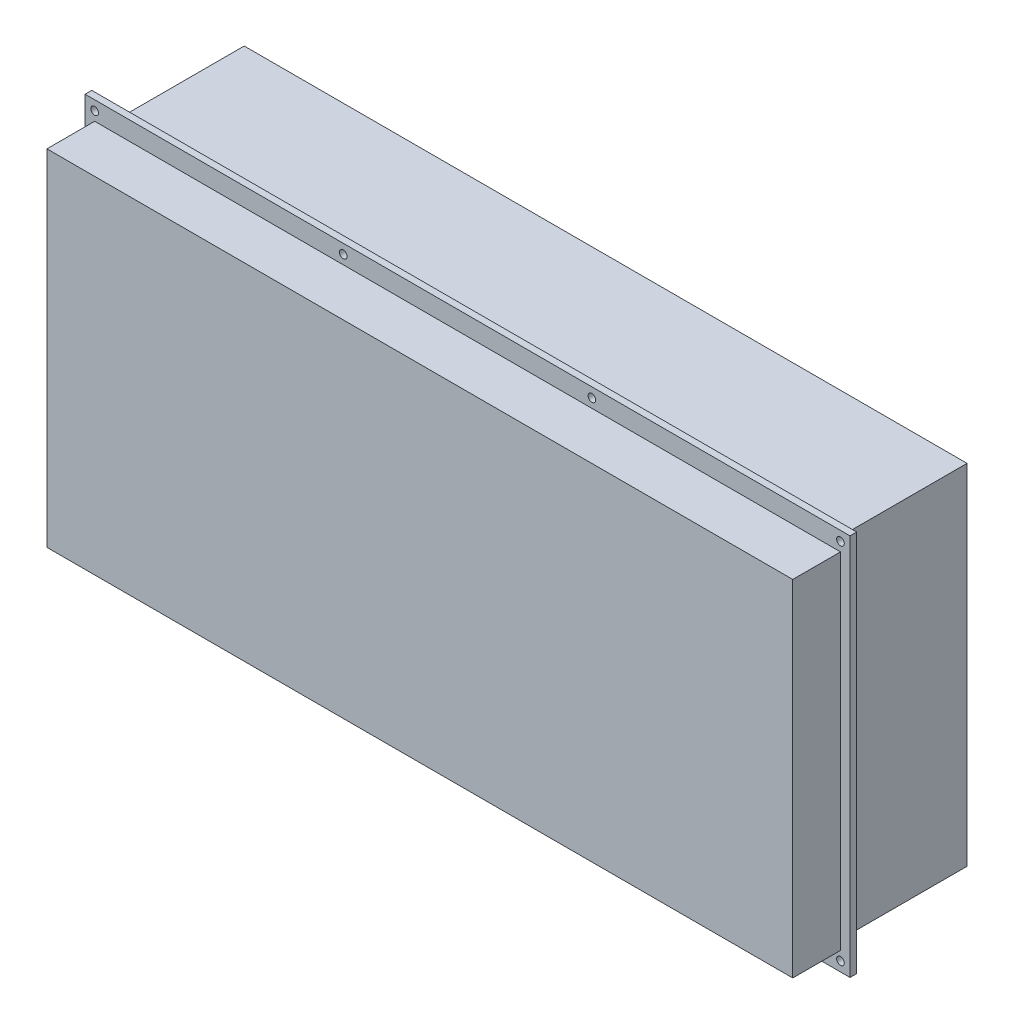
ISO-10303-21;
HEADER;
FILE_DESCRIPTION(('STEP AP214'),'2;1');
FILE_NAME('part.step','',(''),(''),'','','');
FILE_SCHEMA(('AUTOMOTIVE_DESIGN { 1 0 10303 214 1 1 1 1 }'));
ENDSEC;
DATA;
#1=APPLICATION_CONTEXT('core data for automotive mechanical design processes');
#2=APPLICATION_PROTOCOL_DEFINITION('international standard','automotive_design',2000,#1);
#3=PRODUCT_CONTEXT('',#1,'mechanical');
#4=PRODUCT('Part','Part','',(#3));
#5=PRODUCT_RELATED_PRODUCT_CATEGORY('part','',(#4));
#6=PRODUCT_DEFINITION_FORMATION('','',#4);
#7=PRODUCT_DEFINITION_CONTEXT('part definition',#1,'design');
#8=PRODUCT_DEFINITION('design','',#6,#7);
#9=PRODUCT_DEFINITION_SHAPE('','',#8);
#10=(LENGTH_UNIT() NAMED_UNIT(*) SI_UNIT(.MILLI.,.METRE.));
#11=(NAMED_UNIT(*) PLANE_ANGLE_UNIT() SI_UNIT($,.RADIAN.));
#12=(NAMED_UNIT(*) SI_UNIT($,.STERADIAN.) SOLID_ANGLE_UNIT());
#13=UNCERTAINTY_MEASURE_WITH_UNIT(LENGTH_MEASURE(1.E-05),#10,'distance_accuracy_value','');
#14=(GEOMETRIC_REPRESENTATION_CONTEXT(3) GLOBAL_UNCERTAINTY_ASSIGNED_CONTEXT((#13)) GLOBAL_UNIT_ASSIGNED_CONTEXT((#10,
#11,#12)) REPRESENTATION_CONTEXT('',''));
#15=CARTESIAN_POINT('',(0.,0.,0.));
#16=DIRECTION('',(0.,0.,1.));
#17=DIRECTION('',(1.,0.,0.));
#18=AXIS2_PLACEMENT_3D('',#15,#16,#17);
#19=CARTESIAN_POINT('',(0.,0.,-1.75));
#20=DIRECTION('',(0.,0.,-1.));
#21=DIRECTION('',(-1.,0.,0.));
#22=AXIS2_PLACEMENT_3D('',#19,#20,#21);
#23=PLANE('',#22);
#24=CARTESIAN_POINT('',(195.000000000002,-95.,-1.75));
#25=DIRECTION('',(0.,0.,1.));
#26=DIRECTION('',(1.,0.,0.));
#27=AXIS2_PLACEMENT_3D('',#24,#25,#26);
#28=CIRCLE('',#27,2.);
#29=CARTESIAN_POINT('',(197.000000000002,-95.,-1.75));
#30=VERTEX_POINT('',#29);
#31=EDGE_CURVE('E185',#30,#30,#28,.T.);
#32=ORIENTED_EDGE('',*,*,#31,.T.);
#33=EDGE_LOOP('',(#32));
#34=FACE_BOUND('',#33,.T.);
#35=CARTESIAN_POINT('',(-64.999999999998,-95.,-1.75));
#36=DIRECTION('',(0.,0.,1.));
#37=DIRECTION('',(1.,0.,0.));
#38=AXIS2_PLACEMENT_3D('',#35,#36,#37);
#39=CIRCLE('',#38,2.);
#40=CARTESIAN_POINT('',(-62.999999999998,-95.,-1.75));
#41=VERTEX_POINT('',#40);
#42=EDGE_CURVE('E197',#41,#41,#39,.T.);
#43=ORIENTED_EDGE('',*,*,#42,.T.);
#44=EDGE_LOOP('',(#43));
#45=FACE_BOUND('',#44,.T.);
#46=CARTESIAN_POINT('',(65.,95.,-1.75));
#47=DIRECTION('',(0.,0.,1.));
#48=DIRECTION('',(1.,0.,0.));
#49=AXIS2_PLACEMENT_3D('',#46,#47,#48);
#50=CIRCLE('',#49,2.);
#51=CARTESIAN_POINT('',(67.,95.,-1.75));
#52=VERTEX_POINT('',#51);
#53=EDGE_CURVE('E209',#52,#52,#50,.T.);
#54=ORIENTED_EDGE('',*,*,#53,.T.);
#55=EDGE_LOOP('',(#54));
#56=FACE_BOUND('',#55,.T.);
#57=CARTESIAN_POINT('',(-195.,95.,-1.75));
#58=DIRECTION('',(0.,0.,1.));
#59=DIRECTION('',(1.,0.,0.));
#60=AXIS2_PLACEMENT_3D('',#57,#58,#59);
#61=CIRCLE('',#60,2.);
#62=CARTESIAN_POINT('',(-193.,95.,-1.75));
#63=VERTEX_POINT('',#62);
#64=EDGE_CURVE('E221',#63,#63,#61,.T.);
#65=ORIENTED_EDGE('',*,*,#64,.T.);
#66=EDGE_LOOP('',(#65));
#67=FACE_BOUND('',#66,.T.);
#68=DIRECTION('',(0.,1.,0.));
#69=VECTOR('',#68,1.);
#70=CARTESIAN_POINT('',(200.,-100.,-1.75));
#71=LINE('',#70,#69);
#72=CARTESIAN_POINT('',(200.,-100.,-1.75));
#73=VERTEX_POINT('',#72);
#74=CARTESIAN_POINT('',(200.,100.,-1.75));
#75=VERTEX_POINT('',#74);
#76=EDGE_CURVE('E227',#73,#75,#71,.T.);
#77=ORIENTED_EDGE('',*,*,#76,.F.);
#78=DIRECTION('',(1.,0.,0.));
#79=VECTOR('',#78,1.);
#80=CARTESIAN_POINT('',(-200.,-100.,-1.75));
#81=LINE('',#80,#79);
#82=CARTESIAN_POINT('',(-200.,-100.,-1.75));
#83=VERTEX_POINT('',#82);
#84=EDGE_CURVE('E234',#83,#73,#81,.T.);
#85=ORIENTED_EDGE('',*,*,#84,.F.);
#86=DIRECTION('',(0.,-1.,0.));
#87=VECTOR('',#86,1.);
#88=CARTESIAN_POINT('',(-200.,-100.,-1.75));
#89=LINE('',#88,#87);
#90=CARTESIAN_POINT('',(-200.,100.,-1.75));
#91=VERTEX_POINT('',#90);
#92=EDGE_CURVE('E245',#91,#83,#89,.T.);
#93=ORIENTED_EDGE('',*,*,#92,.F.);
#94=DIRECTION('',(-1.,0.,0.));
#95=VECTOR('',#94,1.);
#96=CARTESIAN_POINT('',(-200.,100.,-1.75));
#97=LINE('',#96,#95);
#98=EDGE_CURVE('E243',#75,#91,#97,.T.);
#99=ORIENTED_EDGE('',*,*,#98,.F.);
#100=EDGE_LOOP('',(#77,#85,#93,#99));
#101=FACE_BOUND('',#100,.T.);
#102=CARTESIAN_POINT('',(-65.,95.,-1.75));
#103=DIRECTION('',(0.,0.,1.));
#104=DIRECTION('',(1.,0.,0.));
#105=AXIS2_PLACEMENT_3D('',#102,#103,#104);
#106=CIRCLE('',#105,2.);
#107=CARTESIAN_POINT('',(-63.,95.,-1.75));
#108=VERTEX_POINT('',#107);
#109=EDGE_CURVE('E215',#108,#108,#106,.T.);
#110=ORIENTED_EDGE('',*,*,#109,.T.);
#111=EDGE_LOOP('',(#110));
#112=FACE_BOUND('',#111,.T.);
#113=CARTESIAN_POINT('',(195.,95.,-1.75));
#114=DIRECTION('',(0.,0.,1.));
#115=DIRECTION('',(1.,0.,0.));
#116=AXIS2_PLACEMENT_3D('',#113,#114,#115);
#117=CIRCLE('',#116,2.);
#118=CARTESIAN_POINT('',(197.,95.,-1.75));
#119=VERTEX_POINT('',#118);
#120=EDGE_CURVE('E203',#119,#119,#117,.T.);
#121=ORIENTED_EDGE('',*,*,#120,.T.);
#122=EDGE_LOOP('',(#121));
#123=FACE_BOUND('',#122,.T.);
#124=CARTESIAN_POINT('',(65.000000000002,-95.,-1.75));
#125=DIRECTION('',(0.,0.,1.));
#126=DIRECTION('',(1.,0.,0.));
#127=AXIS2_PLACEMENT_3D('',#124,#125,#126);
#128=CIRCLE('',#127,2.);
#129=CARTESIAN_POINT('',(67.000000000002,-95.,-1.75));
#130=VERTEX_POINT('',#129);
#131=EDGE_CURVE('E191',#130,#130,#128,.T.);
#132=ORIENTED_EDGE('',*,*,#131,.T.);
#133=EDGE_LOOP('',(#132));
#134=FACE_BOUND('',#133,.T.);
#135=CARTESIAN_POINT('',(-194.999999999998,-95.,-1.75));
#136=DIRECTION('',(0.,0.,1.));
#137=DIRECTION('',(1.,0.,0.));
#138=AXIS2_PLACEMENT_3D('',#135,#136,#137);
#139=CIRCLE('',#138,2.);
#140=CARTESIAN_POINT('',(-192.999999999998,-95.,-1.75));
#141=VERTEX_POINT('',#140);
#142=EDGE_CURVE('E181',#141,#141,#139,.T.);
#143=ORIENTED_EDGE('',*,*,#142,.T.);
#144=EDGE_LOOP('',(#143));
#145=FACE_BOUND('',#144,.T.);
#146=DIRECTION('',(1.,0.,0.));
#147=VECTOR('',#146,1.);
#148=CARTESIAN_POINT('',(189.,91.24,-1.75));
#149=LINE('',#148,#147);
#150=CARTESIAN_POINT('',(-189.,91.24,-1.75));
#151=VERTEX_POINT('',#150);
#152=CARTESIAN_POINT('',(189.,91.24,-1.75));
#153=VERTEX_POINT('',#152);
#154=EDGE_CURVE('E504',#151,#153,#149,.T.);
#155=ORIENTED_EDGE('',*,*,#154,.F.);
#156=DIRECTION('',(0.,1.,0.));
#157=VECTOR('',#156,1.);
#158=CARTESIAN_POINT('',(-189.,-91.24,-1.75));
#159=LINE('',#158,#157);
#160=CARTESIAN_POINT('',(-189.,-91.24,-1.75));
#161=VERTEX_POINT('',#160);
#162=EDGE_CURVE('E145',#161,#151,#159,.T.);
#163=ORIENTED_EDGE('',*,*,#162,.F.);
#164=DIRECTION('',(-1.,0.,0.));
#165=VECTOR('',#164,1.);
#166=CARTESIAN_POINT('',(189.,-91.24,-1.75));
#167=LINE('',#166,#165);
#168=CARTESIAN_POINT('',(189.,-91.24,-1.75));
#169=VERTEX_POINT('',#168);
#170=EDGE_CURVE('E141',#169,#161,#167,.T.);
#171=ORIENTED_EDGE('',*,*,#170,.F.);
#172=DIRECTION('',(0.,-1.,0.));
#173=VECTOR('',#172,1.);
#174=CARTESIAN_POINT('',(189.,-91.24,-1.75));
#175=LINE('',#174,#173);
#176=EDGE_CURVE('E501',#153,#169,#175,.T.);
#177=ORIENTED_EDGE('',*,*,#176,.F.);
#178=EDGE_LOOP('',(#155,#163,#171,#177));
#179=FACE_BOUND('',#178,.T.);
#180=ADVANCED_FACE('F33',(#34,#45,#56,#67,#101,#112,#123,#134,#145,#179),#23,.T.);
#181=CARTESIAN_POINT('',(0.,0.,1.75));
#182=DIRECTION('',(0.,0.,-1.));
#183=DIRECTION('',(-1.,0.,0.));
#184=AXIS2_PLACEMENT_3D('',#181,#182,#183);
#185=PLANE('',#184);
#186=CARTESIAN_POINT('',(-194.999999999998,-95.,1.75));
#187=DIRECTION('',(0.,0.,1.));
#188=DIRECTION('',(1.,0.,0.));
#189=AXIS2_PLACEMENT_3D('',#186,#187,#188);
#190=CIRCLE('',#189,2.);
#191=CARTESIAN_POINT('',(-192.999999999998,-95.,1.75));
#192=VERTEX_POINT('',#191);
#193=EDGE_CURVE('E182',#192,#192,#190,.T.);
#194=ORIENTED_EDGE('',*,*,#193,.F.);
#195=EDGE_LOOP('',(#194));
#196=FACE_BOUND('',#195,.T.);
#197=CARTESIAN_POINT('',(195.000000000002,-95.,1.75));
#198=DIRECTION('',(0.,0.,1.));
#199=DIRECTION('',(1.,0.,0.));
#200=AXIS2_PLACEMENT_3D('',#197,#198,#199);
#201=CIRCLE('',#200,2.);
#202=CARTESIAN_POINT('',(197.000000000002,-95.,1.75));
#203=VERTEX_POINT('',#202);
#204=EDGE_CURVE('E188',#203,#203,#201,.T.);
#205=ORIENTED_EDGE('',*,*,#204,.F.);
#206=EDGE_LOOP('',(#205));
#207=FACE_BOUND('',#206,.T.);
#208=CARTESIAN_POINT('',(65.000000000002,-95.,1.75));
#209=DIRECTION('',(0.,0.,1.));
#210=DIRECTION('',(1.,0.,0.));
#211=AXIS2_PLACEMENT_3D('',#208,#209,#210);
#212=CIRCLE('',#211,2.);
#213=CARTESIAN_POINT('',(67.000000000002,-95.,1.75));
#214=VERTEX_POINT('',#213);
#215=EDGE_CURVE('E194',#214,#214,#212,.T.);
#216=ORIENTED_EDGE('',*,*,#215,.F.);
#217=EDGE_LOOP('',(#216));
#218=FACE_BOUND('',#217,.T.);
#219=CARTESIAN_POINT('',(-64.999999999998,-95.,1.75));
#220=DIRECTION('',(0.,0.,1.));
#221=DIRECTION('',(1.,0.,0.));
#222=AXIS2_PLACEMENT_3D('',#219,#220,#221);
#223=CIRCLE('',#222,2.);
#224=CARTESIAN_POINT('',(-62.999999999998,-95.,1.75));
#225=VERTEX_POINT('',#224);
#226=EDGE_CURVE('E200',#225,#225,#223,.T.);
#227=ORIENTED_EDGE('',*,*,#226,.F.);
#228=EDGE_LOOP('',(#227));
#229=FACE_BOUND('',#228,.T.);
#230=CARTESIAN_POINT('',(195.,95.,1.75));
#231=DIRECTION('',(0.,0.,1.));
#232=DIRECTION('',(1.,0.,0.));
#233=AXIS2_PLACEMENT_3D('',#230,#231,#232);
#234=CIRCLE('',#233,2.);
#235=CARTESIAN_POINT('',(197.,95.,1.75));
#236=VERTEX_POINT('',#235);
#237=EDGE_CURVE('E206',#236,#236,#234,.T.);
#238=ORIENTED_EDGE('',*,*,#237,.F.);
#239=EDGE_LOOP('',(#238));
#240=FACE_BOUND('',#239,.T.);
#241=CARTESIAN_POINT('',(65.,95.,1.75));
#242=DIRECTION('',(0.,0.,1.));
#243=DIRECTION('',(1.,0.,0.));
#244=AXIS2_PLACEMENT_3D('',#241,#242,#243);
#245=CIRCLE('',#244,2.);
#246=CARTESIAN_POINT('',(67.,95.,1.75));
#247=VERTEX_POINT('',#246);
#248=EDGE_CURVE('E212',#247,#247,#245,.T.);
#249=ORIENTED_EDGE('',*,*,#248,.F.);
#250=EDGE_LOOP('',(#249));
#251=FACE_BOUND('',#250,.T.);
#252=CARTESIAN_POINT('',(-65.,95.,1.75));
#253=DIRECTION('',(0.,0.,1.));
#254=DIRECTION('',(1.,0.,0.));
#255=AXIS2_PLACEMENT_3D('',#252,#253,#254);
#256=CIRCLE('',#255,2.);
#257=CARTESIAN_POINT('',(-63.,95.,1.75));
#258=VERTEX_POINT('',#257);
#259=EDGE_CURVE('E218',#258,#258,#256,.T.);
#260=ORIENTED_EDGE('',*,*,#259,.F.);
#261=EDGE_LOOP('',(#260));
#262=FACE_BOUND('',#261,.T.);
#263=CARTESIAN_POINT('',(-195.,95.,1.75));
#264=DIRECTION('',(0.,0.,1.));
#265=DIRECTION('',(1.,0.,0.));
#266=AXIS2_PLACEMENT_3D('',#263,#264,#265);
#267=CIRCLE('',#266,2.);
#268=CARTESIAN_POINT('',(-193.,95.,1.75));
#269=VERTEX_POINT('',#268);
#270=EDGE_CURVE('E224',#269,#269,#267,.T.);
#271=ORIENTED_EDGE('',*,*,#270,.F.);
#272=EDGE_LOOP('',(#271));
#273=FACE_BOUND('',#272,.T.);
#274=DIRECTION('',(0.,1.,0.));
#275=VECTOR('',#274,1.);
#276=CARTESIAN_POINT('',(200.,-100.,1.75));
#277=LINE('',#276,#275);
#278=CARTESIAN_POINT('',(200.,-100.,1.75));
#279=VERTEX_POINT('',#278);
#280=CARTESIAN_POINT('',(200.,100.,1.75));
#281=VERTEX_POINT('',#280);
#282=EDGE_CURVE('E230',#279,#281,#277,.T.);
#283=ORIENTED_EDGE('',*,*,#282,.T.);
#284=DIRECTION('',(-1.,0.,0.));
#285=VECTOR('',#284,1.);
#286=CARTESIAN_POINT('',(-200.,100.,1.75));
#287=LINE('',#286,#285);
#288=CARTESIAN_POINT('',(-200.,100.,1.75));
#289=VERTEX_POINT('',#288);
#290=EDGE_CURVE('E233',#281,#289,#287,.T.);
#291=ORIENTED_EDGE('',*,*,#290,.T.);
#292=DIRECTION('',(0.,-1.,0.));
#293=VECTOR('',#292,1.);
#294=CARTESIAN_POINT('',(-200.,-100.,1.75));
#295=LINE('',#294,#293);
#296=CARTESIAN_POINT('',(-200.,-100.,1.75));
#297=VERTEX_POINT('',#296);
#298=EDGE_CURVE('E236',#289,#297,#295,.T.);
#299=ORIENTED_EDGE('',*,*,#298,.T.);
#300=DIRECTION('',(1.,0.,0.));
#301=VECTOR('',#300,1.);
#302=CARTESIAN_POINT('',(-200.,-100.,1.75));
#303=LINE('',#302,#301);
#304=EDGE_CURVE('E238',#297,#279,#303,.T.);
#305=ORIENTED_EDGE('',*,*,#304,.T.);
#306=EDGE_LOOP('',(#283,#291,#299,#305));
#307=FACE_BOUND('',#306,.T.);
#308=DIRECTION('',(0.,1.,0.));
#309=VECTOR('',#308,1.);
#310=CARTESIAN_POINT('',(195.,-90.25,1.75));
#311=LINE('',#310,#309);
#312=CARTESIAN_POINT('',(195.,-90.25,1.75));
#313=VERTEX_POINT('',#312);
#314=CARTESIAN_POINT('',(195.,90.25,1.75));
#315=VERTEX_POINT('',#314);
#316=EDGE_CURVE('E56',#313,#315,#311,.T.);
#317=ORIENTED_EDGE('',*,*,#316,.F.);
#318=DIRECTION('',(1.,0.,0.));
#319=VECTOR('',#318,1.);
#320=CARTESIAN_POINT('',(-195.,-90.25,1.75));
#321=LINE('',#320,#319);
#322=CARTESIAN_POINT('',(-195.,-90.25,1.75));
#323=VERTEX_POINT('',#322);
#324=EDGE_CURVE('E157',#323,#313,#321,.T.);
#325=ORIENTED_EDGE('',*,*,#324,.F.);
#326=DIRECTION('',(0.,-1.,0.));
#327=VECTOR('',#326,1.);
#328=CARTESIAN_POINT('',(-195.,-90.25,1.75));
#329=LINE('',#328,#327);
#330=CARTESIAN_POINT('',(-195.,90.25,1.75));
#331=VERTEX_POINT('',#330);
#332=EDGE_CURVE('E166',#331,#323,#329,.T.);
#333=ORIENTED_EDGE('',*,*,#332,.F.);
#334=DIRECTION('',(-1.,0.,0.));
#335=VECTOR('',#334,1.);
#336=CARTESIAN_POINT('',(-195.,90.25,1.75));
#337=LINE('',#336,#335);
#338=EDGE_CURVE('E148',#315,#331,#337,.T.);
#339=ORIENTED_EDGE('',*,*,#338,.F.);
#340=EDGE_LOOP('',(#317,#325,#333,#339));
#341=FACE_BOUND('',#340,.T.);
#342=ADVANCED_FACE('F272',(#196,#207,#218,#229,#240,#251,#262,#273,#307,#341),#185,.F.);
#343=CARTESIAN_POINT('',(200.,-100.,1.75));
#344=DIRECTION('',(-1.,0.,0.));
#345=DIRECTION('',(0.,0.,1.));
#346=AXIS2_PLACEMENT_3D('',#343,#344,#345);
#347=PLANE('',#346);
#348=ORIENTED_EDGE('',*,*,#76,.T.);
#349=DIRECTION('',(0.,0.,-1.));
#350=VECTOR('',#349,1.);
#351=CARTESIAN_POINT('',(200.,100.,1.75));
#352=LINE('',#351,#350);
#353=EDGE_CURVE('E11',#281,#75,#352,.T.);
#354=ORIENTED_EDGE('',*,*,#353,.F.);
#355=ORIENTED_EDGE('',*,*,#282,.F.);
#356=DIRECTION('',(0.,0.,-1.));
#357=VECTOR('',#356,1.);
#358=CARTESIAN_POINT('',(200.,-100.,1.75));
#359=LINE('',#358,#357);
#360=EDGE_CURVE('E240',#279,#73,#359,.T.);
#361=ORIENTED_EDGE('',*,*,#360,.T.);
#362=EDGE_LOOP('',(#348,#354,#355,#361));
#363=FACE_BOUND('',#362,.T.);
#364=ADVANCED_FACE('F35',(#363),#347,.F.);
#365=CARTESIAN_POINT('',(-200.,100.,1.75));
#366=DIRECTION('',(0.,-1.,0.));
#367=DIRECTION('',(0.,0.,-1.));
#368=AXIS2_PLACEMENT_3D('',#365,#366,#367);
#369=PLANE('',#368);
#370=ORIENTED_EDGE('',*,*,#98,.T.);
#371=DIRECTION('',(0.,0.,-1.));
#372=VECTOR('',#371,1.);
#373=CARTESIAN_POINT('',(-200.,100.,1.75));
#374=LINE('',#373,#372);
#375=EDGE_CURVE('E41',#289,#91,#374,.T.);
#376=ORIENTED_EDGE('',*,*,#375,.F.);
#377=ORIENTED_EDGE('',*,*,#290,.F.);
#378=ORIENTED_EDGE('',*,*,#353,.T.);
#379=EDGE_LOOP('',(#370,#376,#377,#378));
#380=FACE_BOUND('',#379,.T.);
#381=ADVANCED_FACE('F273',(#380),#369,.F.);
#382=CARTESIAN_POINT('',(-200.,-100.,1.75));
#383=DIRECTION('',(1.,0.,0.));
#384=DIRECTION('',(0.,0.,-1.));
#385=AXIS2_PLACEMENT_3D('',#382,#383,#384);
#386=PLANE('',#385);
#387=ORIENTED_EDGE('',*,*,#92,.T.);
#388=DIRECTION('',(0.,0.,-1.));
#389=VECTOR('',#388,1.);
#390=CARTESIAN_POINT('',(-200.,-100.,1.75));
#391=LINE('',#390,#389);
#392=EDGE_CURVE('E250',#297,#83,#391,.T.);
#393=ORIENTED_EDGE('',*,*,#392,.F.);
#394=ORIENTED_EDGE('',*,*,#298,.F.);
#395=ORIENTED_EDGE('',*,*,#375,.T.);
#396=EDGE_LOOP('',(#387,#393,#394,#395));
#397=FACE_BOUND('',#396,.T.);
#398=ADVANCED_FACE('F257',(#397),#386,.F.);
#399=CARTESIAN_POINT('',(-200.,-100.,1.75));
#400=DIRECTION('',(0.,1.,0.));
#401=DIRECTION('',(0.,0.,1.));
#402=AXIS2_PLACEMENT_3D('',#399,#400,#401);
#403=PLANE('',#402);
#404=ORIENTED_EDGE('',*,*,#84,.T.);
#405=ORIENTED_EDGE('',*,*,#360,.F.);
#406=ORIENTED_EDGE('',*,*,#304,.F.);
#407=ORIENTED_EDGE('',*,*,#392,.T.);
#408=EDGE_LOOP('',(#404,#405,#406,#407));
#409=FACE_BOUND('',#408,.T.);
#410=ADVANCED_FACE('F266',(#409),#403,.F.);
#411=CARTESIAN_POINT('',(-195.,95.,1.75));
#412=DIRECTION('',(0.,0.,-1.));
#413=DIRECTION('',(-1.,0.,0.));
#414=AXIS2_PLACEMENT_3D('',#411,#412,#413);
#415=CYLINDRICAL_SURFACE('',#414,2.);
#416=ORIENTED_EDGE('',*,*,#270,.T.);
#417=EDGE_LOOP('',(#416));
#418=FACE_BOUND('',#417,.T.);
#419=ORIENTED_EDGE('',*,*,#64,.F.);
#420=EDGE_LOOP('',(#419));
#421=FACE_BOUND('',#420,.T.);
#422=ADVANCED_FACE('F292',(#418,#421),#415,.F.);
#423=CARTESIAN_POINT('',(-65.,95.,1.75));
#424=DIRECTION('',(0.,0.,-1.));
#425=DIRECTION('',(-1.,0.,0.));
#426=AXIS2_PLACEMENT_3D('',#423,#424,#425);
#427=CYLINDRICAL_SURFACE('',#426,2.);
#428=ORIENTED_EDGE('',*,*,#259,.T.);
#429=EDGE_LOOP('',(#428));
#430=FACE_BOUND('',#429,.T.);
#431=ORIENTED_EDGE('',*,*,#109,.F.);
#432=EDGE_LOOP('',(#431));
#433=FACE_BOUND('',#432,.T.);
#434=ADVANCED_FACE('F296',(#430,#433),#427,.F.);
#435=CARTESIAN_POINT('',(65.,95.,1.75));
#436=DIRECTION('',(0.,0.,-1.));
#437=DIRECTION('',(-1.,0.,0.));
#438=AXIS2_PLACEMENT_3D('',#435,#436,#437);
#439=CYLINDRICAL_SURFACE('',#438,2.);
#440=ORIENTED_EDGE('',*,*,#248,.T.);
#441=EDGE_LOOP('',(#440));
#442=FACE_BOUND('',#441,.T.);
#443=ORIENTED_EDGE('',*,*,#53,.F.);
#444=EDGE_LOOP('',(#443));
#445=FACE_BOUND('',#444,.T.);
#446=ADVANCED_FACE('F301',(#442,#445),#439,.F.);
#447=CARTESIAN_POINT('',(195.,95.,1.75));
#448=DIRECTION('',(0.,0.,-1.));
#449=DIRECTION('',(-1.,0.,0.));
#450=AXIS2_PLACEMENT_3D('',#447,#448,#449);
#451=CYLINDRICAL_SURFACE('',#450,2.);
#452=ORIENTED_EDGE('',*,*,#237,.T.);
#453=EDGE_LOOP('',(#452));
#454=FACE_BOUND('',#453,.T.);
#455=ORIENTED_EDGE('',*,*,#120,.F.);
#456=EDGE_LOOP('',(#455));
#457=FACE_BOUND('',#456,.T.);
#458=ADVANCED_FACE('F308',(#454,#457),#451,.F.);
#459=CARTESIAN_POINT('',(-64.999999999998,-95.,1.75));
#460=DIRECTION('',(0.,0.,-1.));
#461=DIRECTION('',(-1.,0.,0.));
#462=AXIS2_PLACEMENT_3D('',#459,#460,#461);
#463=CYLINDRICAL_SURFACE('',#462,2.);
#464=ORIENTED_EDGE('',*,*,#226,.T.);
#465=EDGE_LOOP('',(#464));
#466=FACE_BOUND('',#465,.T.);
#467=ORIENTED_EDGE('',*,*,#42,.F.);
#468=EDGE_LOOP('',(#467));
#469=FACE_BOUND('',#468,.T.);
#470=ADVANCED_FACE('F312',(#466,#469),#463,.F.);
#471=CARTESIAN_POINT('',(65.000000000002,-95.,1.75));
#472=DIRECTION('',(0.,0.,-1.));
#473=DIRECTION('',(-1.,0.,0.));
#474=AXIS2_PLACEMENT_3D('',#471,#472,#473);
#475=CYLINDRICAL_SURFACE('',#474,2.);
#476=ORIENTED_EDGE('',*,*,#215,.T.);
#477=EDGE_LOOP('',(#476));
#478=FACE_BOUND('',#477,.T.);
#479=ORIENTED_EDGE('',*,*,#131,.F.);
#480=EDGE_LOOP('',(#479));
#481=FACE_BOUND('',#480,.T.);
#482=ADVANCED_FACE('F316',(#478,#481),#475,.F.);
#483=CARTESIAN_POINT('',(195.000000000002,-95.,1.75));
#484=DIRECTION('',(0.,0.,-1.));
#485=DIRECTION('',(-1.,0.,0.));
#486=AXIS2_PLACEMENT_3D('',#483,#484,#485);
#487=CYLINDRICAL_SURFACE('',#486,2.);
#488=ORIENTED_EDGE('',*,*,#204,.T.);
#489=EDGE_LOOP('',(#488));
#490=FACE_BOUND('',#489,.T.);
#491=ORIENTED_EDGE('',*,*,#31,.F.);
#492=EDGE_LOOP('',(#491));
#493=FACE_BOUND('',#492,.T.);
#494=ADVANCED_FACE('F320',(#490,#493),#487,.F.);
#495=CARTESIAN_POINT('',(-194.999999999998,-95.,1.75));
#496=DIRECTION('',(0.,0.,-1.));
#497=DIRECTION('',(-1.,0.,0.));
#498=AXIS2_PLACEMENT_3D('',#495,#496,#497);
#499=CYLINDRICAL_SURFACE('',#498,2.);
#500=ORIENTED_EDGE('',*,*,#193,.T.);
#501=EDGE_LOOP('',(#500));
#502=FACE_BOUND('',#501,.T.);
#503=ORIENTED_EDGE('',*,*,#142,.F.);
#504=EDGE_LOOP('',(#503));
#505=FACE_BOUND('',#504,.T.);
#506=ADVANCED_FACE('F324',(#502,#505),#499,.F.);
#507=CARTESIAN_POINT('',(195.,-90.25,26.703));
#508=DIRECTION('',(-1.,0.,0.));
#509=DIRECTION('',(0.,0.,1.));
#510=AXIS2_PLACEMENT_3D('',#507,#508,#509);
#511=PLANE('',#510);
#512=ORIENTED_EDGE('',*,*,#316,.T.);
#513=DIRECTION('',(0.,0.,-1.));
#514=VECTOR('',#513,1.);
#515=CARTESIAN_POINT('',(195.,90.25,26.703));
#516=LINE('',#515,#514);
#517=CARTESIAN_POINT('',(195.,90.25,26.703));
#518=VERTEX_POINT('',#517);
#519=EDGE_CURVE('E178',#518,#315,#516,.T.);
#520=ORIENTED_EDGE('',*,*,#519,.F.);
#521=DIRECTION('',(0.,1.,0.));
#522=VECTOR('',#521,1.);
#523=CARTESIAN_POINT('',(195.,-90.25,26.703));
#524=LINE('',#523,#522);
#525=CARTESIAN_POINT('',(195.,-90.25,26.703));
#526=VERTEX_POINT('',#525);
#527=EDGE_CURVE('E153',#526,#518,#524,.T.);
#528=ORIENTED_EDGE('',*,*,#527,.F.);
#529=DIRECTION('',(0.,0.,-1.));
#530=VECTOR('',#529,1.);
#531=CARTESIAN_POINT('',(195.,-90.25,26.703));
#532=LINE('',#531,#530);
#533=EDGE_CURVE('E162',#526,#313,#532,.T.);
#534=ORIENTED_EDGE('',*,*,#533,.T.);
#535=EDGE_LOOP('',(#512,#520,#528,#534));
#536=FACE_BOUND('',#535,.T.);
#537=ADVANCED_FACE('F328',(#536),#511,.F.);
#538=CARTESIAN_POINT('',(-195.,90.25,26.703));
#539=DIRECTION('',(0.,-1.,0.));
#540=DIRECTION('',(0.,0.,-1.));
#541=AXIS2_PLACEMENT_3D('',#538,#539,#540);
#542=PLANE('',#541);
#543=ORIENTED_EDGE('',*,*,#338,.T.);
#544=DIRECTION('',(0.,0.,-1.));
#545=VECTOR('',#544,1.);
#546=CARTESIAN_POINT('',(-195.,90.25,26.703));
#547=LINE('',#546,#545);
#548=CARTESIAN_POINT('',(-195.,90.25,26.703));
#549=VERTEX_POINT('',#548);
#550=EDGE_CURVE('E175',#549,#331,#547,.T.);
#551=ORIENTED_EDGE('',*,*,#550,.F.);
#552=DIRECTION('',(-1.,0.,0.));
#553=VECTOR('',#552,1.);
#554=CARTESIAN_POINT('',(-195.,90.25,26.703));
#555=LINE('',#554,#553);
#556=EDGE_CURVE('E156',#518,#549,#555,.T.);
#557=ORIENTED_EDGE('',*,*,#556,.F.);
#558=ORIENTED_EDGE('',*,*,#519,.T.);
#559=EDGE_LOOP('',(#543,#551,#557,#558));
#560=FACE_BOUND('',#559,.T.);
#561=ADVANCED_FACE('F332',(#560),#542,.F.);
#562=CARTESIAN_POINT('',(-195.,-90.25,26.703));
#563=DIRECTION('',(1.,0.,0.));
#564=DIRECTION('',(0.,0.,-1.));
#565=AXIS2_PLACEMENT_3D('',#562,#563,#564);
#566=PLANE('',#565);
#567=ORIENTED_EDGE('',*,*,#332,.T.);
#568=DIRECTION('',(0.,0.,-1.));
#569=VECTOR('',#568,1.);
#570=CARTESIAN_POINT('',(-195.,-90.25,26.703));
#571=LINE('',#570,#569);
#572=CARTESIAN_POINT('',(-195.,-90.25,26.703));
#573=VERTEX_POINT('',#572);
#574=EDGE_CURVE('E172',#573,#323,#571,.T.);
#575=ORIENTED_EDGE('',*,*,#574,.F.);
#576=DIRECTION('',(0.,-1.,0.));
#577=VECTOR('',#576,1.);
#578=CARTESIAN_POINT('',(-195.,-90.25,26.703));
#579=LINE('',#578,#577);
#580=EDGE_CURVE('E159',#549,#573,#579,.T.);
#581=ORIENTED_EDGE('',*,*,#580,.F.);
#582=ORIENTED_EDGE('',*,*,#550,.T.);
#583=EDGE_LOOP('',(#567,#575,#581,#582));
#584=FACE_BOUND('',#583,.T.);
#585=ADVANCED_FACE('F336',(#584),#566,.F.);
#586=CARTESIAN_POINT('',(-195.,-90.25,26.703));
#587=DIRECTION('',(0.,1.,0.));
#588=DIRECTION('',(0.,0.,1.));
#589=AXIS2_PLACEMENT_3D('',#586,#587,#588);
#590=PLANE('',#589);
#591=ORIENTED_EDGE('',*,*,#324,.T.);
#592=ORIENTED_EDGE('',*,*,#533,.F.);
#593=DIRECTION('',(1.,0.,0.));
#594=VECTOR('',#593,1.);
#595=CARTESIAN_POINT('',(-195.,-90.25,26.703));
#596=LINE('',#595,#594);
#597=EDGE_CURVE('E161',#573,#526,#596,.T.);
#598=ORIENTED_EDGE('',*,*,#597,.F.);
#599=ORIENTED_EDGE('',*,*,#574,.T.);
#600=EDGE_LOOP('',(#591,#592,#598,#599));
#601=FACE_BOUND('',#600,.T.);
#602=ADVANCED_FACE('F340',(#601),#590,.F.);
#603=CARTESIAN_POINT('',(0.,0.,26.703));
#604=DIRECTION('',(0.,0.,-1.));
#605=DIRECTION('',(-1.,0.,0.));
#606=AXIS2_PLACEMENT_3D('',#603,#604,#605);
#607=PLANE('',#606);
#608=ORIENTED_EDGE('',*,*,#527,.T.);
#609=ORIENTED_EDGE('',*,*,#556,.T.);
#610=ORIENTED_EDGE('',*,*,#580,.T.);
#611=ORIENTED_EDGE('',*,*,#597,.T.);
#612=EDGE_LOOP('',(#608,#609,#610,#611));
#613=FACE_BOUND('',#612,.T.);
#614=ADVANCED_FACE('F344',(#613),#607,.F.);
#615=CARTESIAN_POINT('',(-189.,-91.24,-70.45));
#616=DIRECTION('',(1.,0.,0.));
#617=DIRECTION('',(0.,0.,-1.));
#618=AXIS2_PLACEMENT_3D('',#615,#616,#617);
#619=PLANE('',#618);
#620=ORIENTED_EDGE('',*,*,#162,.T.);
#621=DIRECTION('',(0.,0.,1.));
#622=VECTOR('',#621,1.);
#623=CARTESIAN_POINT('',(-189.,91.24,-70.45));
#624=LINE('',#623,#622);
#625=CARTESIAN_POINT('',(-189.,91.24,-70.45));
#626=VERTEX_POINT('',#625);
#627=EDGE_CURVE('E126',#626,#151,#624,.T.);
#628=ORIENTED_EDGE('',*,*,#627,.F.);
#629=DIRECTION('',(0.,1.,0.));
#630=VECTOR('',#629,1.);
#631=CARTESIAN_POINT('',(-189.,-91.24,-70.45));
#632=LINE('',#631,#630);
#633=CARTESIAN_POINT('',(-189.,-91.24,-70.45));
#634=VERTEX_POINT('',#633);
#635=EDGE_CURVE('E133',#634,#626,#632,.T.);
#636=ORIENTED_EDGE('',*,*,#635,.F.);
#637=DIRECTION('',(0.,0.,1.));
#638=VECTOR('',#637,1.);
#639=CARTESIAN_POINT('',(-189.,-91.24,-70.45));
#640=LINE('',#639,#638);
#641=EDGE_CURVE('E498',#634,#161,#640,.T.);
#642=ORIENTED_EDGE('',*,*,#641,.T.);
#643=EDGE_LOOP('',(#620,#628,#636,#642));
#644=FACE_BOUND('',#643,.T.);
#645=ADVANCED_FACE('F143',(#644),#619,.F.);
#646=CARTESIAN_POINT('',(189.,91.24,-70.45));
#647=DIRECTION('',(0.,-1.,0.));
#648=DIRECTION('',(0.,0.,-1.));
#649=AXIS2_PLACEMENT_3D('',#646,#647,#648);
#650=PLANE('',#649);
#651=ORIENTED_EDGE('',*,*,#154,.T.);
#652=DIRECTION('',(0.,0.,1.));
#653=VECTOR('',#652,1.);
#654=CARTESIAN_POINT('',(189.,91.24,-70.45));
#655=LINE('',#654,#653);
#656=CARTESIAN_POINT('',(189.,91.24,-70.45));
#657=VERTEX_POINT('',#656);
#658=EDGE_CURVE('E129',#657,#153,#655,.T.);
#659=ORIENTED_EDGE('',*,*,#658,.F.);
#660=DIRECTION('',(1.,0.,0.));
#661=VECTOR('',#660,1.);
#662=CARTESIAN_POINT('',(189.,91.24,-70.45));
#663=LINE('',#662,#661);
#664=EDGE_CURVE('E122',#626,#657,#663,.T.);
#665=ORIENTED_EDGE('',*,*,#664,.F.);
#666=ORIENTED_EDGE('',*,*,#627,.T.);
#667=EDGE_LOOP('',(#651,#659,#665,#666));
#668=FACE_BOUND('',#667,.T.);
#669=ADVANCED_FACE('F124',(#668),#650,.F.);
#670=CARTESIAN_POINT('',(189.,-91.24,-70.45));
#671=DIRECTION('',(-1.,0.,0.));
#672=DIRECTION('',(0.,0.,1.));
#673=AXIS2_PLACEMENT_3D('',#670,#671,#672);
#674=PLANE('',#673);
#675=ORIENTED_EDGE('',*,*,#176,.T.);
#676=DIRECTION('',(0.,0.,1.));
#677=VECTOR('',#676,1.);
#678=CARTESIAN_POINT('',(189.,-91.24,-70.45));
#679=LINE('',#678,#677);
#680=CARTESIAN_POINT('',(189.,-91.24,-70.45));
#681=VERTEX_POINT('',#680);
#682=EDGE_CURVE('E48',#681,#169,#679,.T.);
#683=ORIENTED_EDGE('',*,*,#682,.F.);
#684=DIRECTION('',(0.,-1.,0.));
#685=VECTOR('',#684,1.);
#686=CARTESIAN_POINT('',(189.,-91.24,-70.45));
#687=LINE('',#686,#685);
#688=EDGE_CURVE('E132',#657,#681,#687,.T.);
#689=ORIENTED_EDGE('',*,*,#688,.F.);
#690=ORIENTED_EDGE('',*,*,#658,.T.);
#691=EDGE_LOOP('',(#675,#683,#689,#690));
#692=FACE_BOUND('',#691,.T.);
#693=ADVANCED_FACE('F353',(#692),#674,.F.);
#694=CARTESIAN_POINT('',(189.,-91.24,-70.45));
#695=DIRECTION('',(0.,1.,0.));
#696=DIRECTION('',(0.,0.,1.));
#697=AXIS2_PLACEMENT_3D('',#694,#695,#696);
#698=PLANE('',#697);
#699=ORIENTED_EDGE('',*,*,#170,.T.);
#700=ORIENTED_EDGE('',*,*,#641,.F.);
#701=DIRECTION('',(-1.,0.,0.));
#702=VECTOR('',#701,1.);
#703=CARTESIAN_POINT('',(189.,-91.24,-70.45));
#704=LINE('',#703,#702);
#705=EDGE_CURVE('E137',#681,#634,#704,.T.);
#706=ORIENTED_EDGE('',*,*,#705,.F.);
#707=ORIENTED_EDGE('',*,*,#682,.T.);
#708=EDGE_LOOP('',(#699,#700,#706,#707));
#709=FACE_BOUND('',#708,.T.);
#710=ADVANCED_FACE('F356',(#709),#698,.F.);
#711=CARTESIAN_POINT('',(0.,0.,-70.45));
#712=DIRECTION('',(0.,0.,1.));
#713=DIRECTION('',(1.,0.,0.));
#714=AXIS2_PLACEMENT_3D('',#711,#712,#713);
#715=PLANE('',#714);
#716=ORIENTED_EDGE('',*,*,#635,.T.);
#717=ORIENTED_EDGE('',*,*,#664,.T.);
#718=ORIENTED_EDGE('',*,*,#688,.T.);
#719=ORIENTED_EDGE('',*,*,#705,.T.);
#720=EDGE_LOOP('',(#716,#717,#718,#719));
#721=FACE_BOUND('',#720,.T.);
#722=ADVANCED_FACE('F136',(#721),#715,.F.);
#723=CLOSED_SHELL('',(#180,#342,#364,#381,#398,#410,#422,#434,#446,#458,#470,#482,#494,#506,
#537,#561,#585,#602,#614,#645,#669,#693,#710,#722));
#724=MANIFOLD_SOLID_BREP('B2',#723);
#725=ADVANCED_BREP_SHAPE_REPRESENTATION('',(#18,#724),#14);
#726=SHAPE_DEFINITION_REPRESENTATION(#9,#725);
ENDSEC;
END-ISO-10303-21;
